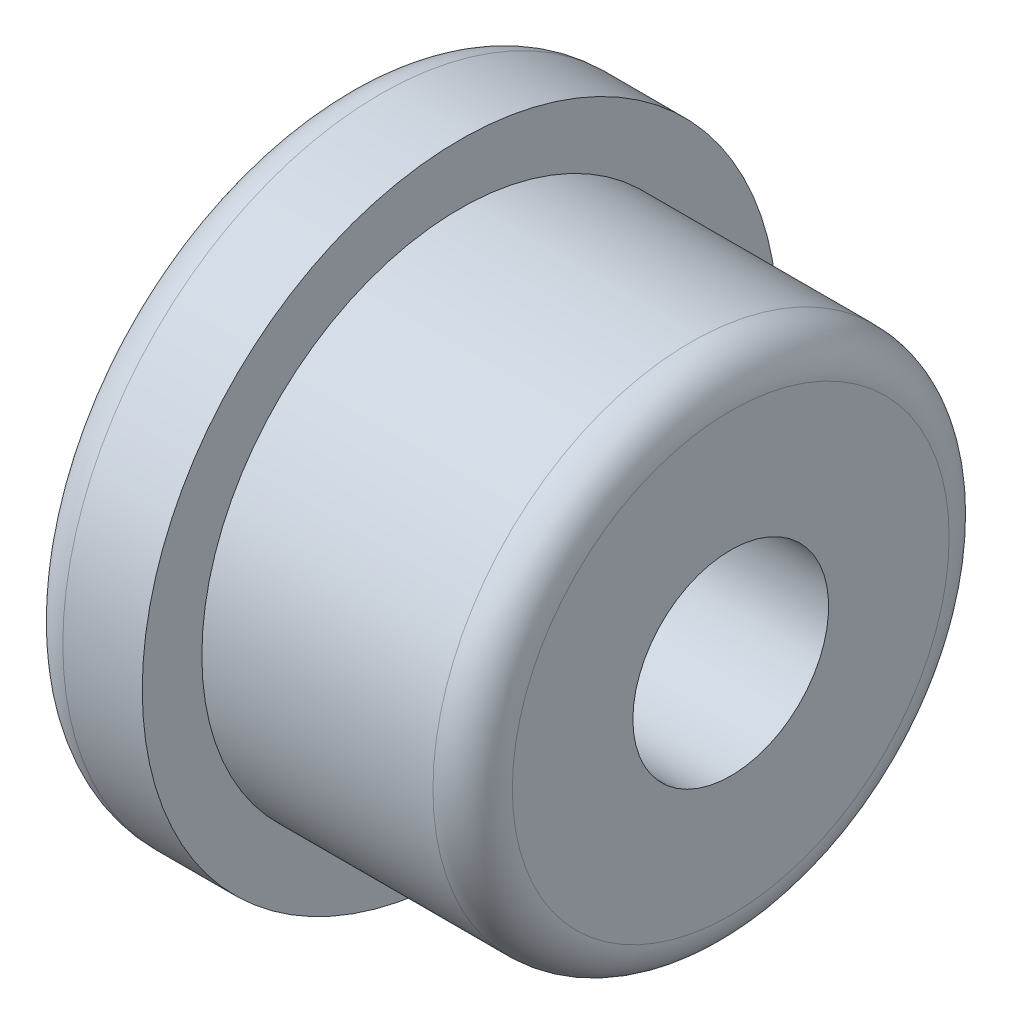
ISO-10303-21;
HEADER;
FILE_DESCRIPTION(('STEP AP214'),'2;1');
FILE_NAME('part.step','',(''),(''),'','','');
FILE_SCHEMA(('AUTOMOTIVE_DESIGN { 1 0 10303 214 1 1 1 1 }'));
ENDSEC;
DATA;
#1=APPLICATION_CONTEXT('core data for automotive mechanical design processes');
#2=APPLICATION_PROTOCOL_DEFINITION('international standard','automotive_design',2000,#1);
#3=PRODUCT_CONTEXT('',#1,'mechanical');
#4=PRODUCT('Part','Part','',(#3));
#5=PRODUCT_RELATED_PRODUCT_CATEGORY('part','',(#4));
#6=PRODUCT_DEFINITION_FORMATION('','',#4);
#7=PRODUCT_DEFINITION_CONTEXT('part definition',#1,'design');
#8=PRODUCT_DEFINITION('design','',#6,#7);
#9=PRODUCT_DEFINITION_SHAPE('','',#8);
#10=(LENGTH_UNIT() NAMED_UNIT(*) SI_UNIT(.MILLI.,.METRE.));
#11=(NAMED_UNIT(*) PLANE_ANGLE_UNIT() SI_UNIT($,.RADIAN.));
#12=(NAMED_UNIT(*) SI_UNIT($,.STERADIAN.) SOLID_ANGLE_UNIT());
#13=UNCERTAINTY_MEASURE_WITH_UNIT(LENGTH_MEASURE(1.E-05),#10,'distance_accuracy_value','');
#14=(GEOMETRIC_REPRESENTATION_CONTEXT(3) GLOBAL_UNCERTAINTY_ASSIGNED_CONTEXT((#13)) GLOBAL_UNIT_ASSIGNED_CONTEXT((#10,
#11,#12)) REPRESENTATION_CONTEXT('',''));
#15=CARTESIAN_POINT('',(0.,0.,0.));
#16=DIRECTION('',(0.,0.,1.));
#17=DIRECTION('',(1.,0.,0.));
#18=AXIS2_PLACEMENT_3D('',#15,#16,#17);
#19=CARTESIAN_POINT('',(0.,8.,0.));
#20=DIRECTION('',(1.,0.,0.));
#21=DIRECTION('',(0.,0.,-1.));
#22=AXIS2_PLACEMENT_3D('',#19,#20,#21);
#23=PLANE('',#22);
#24=CARTESIAN_POINT('',(0.,0.,0.));
#25=DIRECTION('',(1.,0.,0.));
#26=DIRECTION('',(0.,0.,-1.));
#27=AXIS2_PLACEMENT_3D('',#24,#25,#26);
#28=CIRCLE('',#27,7.);
#29=CARTESIAN_POINT('',(0.,0.,-7.));
#30=VERTEX_POINT('',#29);
#31=EDGE_CURVE('E44',#30,#30,#28,.F.);
#32=ORIENTED_EDGE('',*,*,#31,.T.);
#33=EDGE_LOOP('',(#32));
#34=FACE_BOUND('',#33,.T.);
#35=CARTESIAN_POINT('',(0.,0.,0.));
#36=DIRECTION('',(-1.,0.,0.));
#37=DIRECTION('',(0.,0.,1.));
#38=AXIS2_PLACEMENT_3D('',#35,#36,#37);
#39=CIRCLE('',#38,2.465);
#40=CARTESIAN_POINT('',(0.,0.,2.465));
#41=VERTEX_POINT('',#40);
#42=EDGE_CURVE('E57',#41,#41,#39,.T.);
#43=ORIENTED_EDGE('',*,*,#42,.F.);
#44=EDGE_LOOP('',(#43));
#45=FACE_BOUND('',#44,.T.);
#46=ADVANCED_FACE('F37',(#34,#45),#23,.F.);
#47=CARTESIAN_POINT('',(0.,0.,0.));
#48=DIRECTION('',(-1.,0.,0.));
#49=DIRECTION('',(0.,0.,1.));
#50=AXIS2_PLACEMENT_3D('',#47,#48,#49);
#51=CYLINDRICAL_SURFACE('',#50,2.465);
#52=CARTESIAN_POINT('',(9.82,0.,0.));
#53=DIRECTION('',(-1.,0.,0.));
#54=DIRECTION('',(0.,0.,1.));
#55=AXIS2_PLACEMENT_3D('',#52,#53,#54);
#56=CIRCLE('',#55,2.465);
#57=CARTESIAN_POINT('',(9.82,0.,2.465));
#58=VERTEX_POINT('',#57);
#59=EDGE_CURVE('E60',#58,#58,#56,.T.);
#60=ORIENTED_EDGE('',*,*,#59,.F.);
#61=EDGE_LOOP('',(#60));
#62=FACE_BOUND('',#61,.T.);
#63=ORIENTED_EDGE('',*,*,#42,.T.);
#64=EDGE_LOOP('',(#63));
#65=FACE_BOUND('',#64,.T.);
#66=ADVANCED_FACE('F87',(#62,#65),#51,.F.);
#67=CARTESIAN_POINT('',(9.82,2.465,0.));
#68=DIRECTION('',(-1.,0.,0.));
#69=DIRECTION('',(0.,0.,1.));
#70=AXIS2_PLACEMENT_3D('',#67,#68,#69);
#71=PLANE('',#70);
#72=CARTESIAN_POINT('',(9.82,0.,0.));
#73=DIRECTION('',(-1.,0.,0.));
#74=DIRECTION('',(0.,0.,1.));
#75=AXIS2_PLACEMENT_3D('',#72,#73,#74);
#76=CIRCLE('',#75,5.5);
#77=CARTESIAN_POINT('',(9.82,0.,5.5));
#78=VERTEX_POINT('',#77);
#79=EDGE_CURVE('E48',#78,#78,#76,.F.);
#80=ORIENTED_EDGE('',*,*,#79,.T.);
#81=EDGE_LOOP('',(#80));
#82=FACE_BOUND('',#81,.T.);
#83=ORIENTED_EDGE('',*,*,#59,.T.);
#84=EDGE_LOOP('',(#83));
#85=FACE_BOUND('',#84,.T.);
#86=ADVANCED_FACE('F80',(#82,#85),#71,.F.);
#87=CARTESIAN_POINT('',(0.,0.,0.));
#88=DIRECTION('',(-1.,0.,0.));
#89=DIRECTION('',(0.,0.,1.));
#90=AXIS2_PLACEMENT_3D('',#87,#88,#89);
#91=CYLINDRICAL_SURFACE('',#90,6.5);
#92=CARTESIAN_POINT('',(8.82,0.,0.));
#93=DIRECTION('',(-1.,0.,0.));
#94=DIRECTION('',(0.,0.,1.));
#95=AXIS2_PLACEMENT_3D('',#92,#93,#94);
#96=CIRCLE('',#95,6.5);
#97=CARTESIAN_POINT('',(8.82,0.,6.5));
#98=VERTEX_POINT('',#97);
#99=EDGE_CURVE('E52',#98,#98,#96,.T.);
#100=ORIENTED_EDGE('',*,*,#99,.T.);
#101=EDGE_LOOP('',(#100));
#102=FACE_BOUND('',#101,.T.);
#103=CARTESIAN_POINT('',(3.,0.,0.));
#104=DIRECTION('',(-1.,0.,0.));
#105=DIRECTION('',(0.,0.,1.));
#106=AXIS2_PLACEMENT_3D('',#103,#104,#105);
#107=CIRCLE('',#106,6.5);
#108=CARTESIAN_POINT('',(3.,0.,6.5));
#109=VERTEX_POINT('',#108);
#110=EDGE_CURVE('E63',#109,#109,#107,.T.);
#111=ORIENTED_EDGE('',*,*,#110,.F.);
#112=EDGE_LOOP('',(#111));
#113=FACE_BOUND('',#112,.T.);
#114=ADVANCED_FACE('F75',(#102,#113),#91,.T.);
#115=CARTESIAN_POINT('',(3.,6.5,0.));
#116=DIRECTION('',(-1.,0.,0.));
#117=DIRECTION('',(0.,0.,1.));
#118=AXIS2_PLACEMENT_3D('',#115,#116,#117);
#119=PLANE('',#118);
#120=CARTESIAN_POINT('',(3.,0.,0.));
#121=DIRECTION('',(-1.,0.,0.));
#122=DIRECTION('',(0.,0.,1.));
#123=AXIS2_PLACEMENT_3D('',#120,#121,#122);
#124=CIRCLE('',#123,8.);
#125=CARTESIAN_POINT('',(3.,0.,8.));
#126=VERTEX_POINT('',#125);
#127=EDGE_CURVE('E66',#126,#126,#124,.T.);
#128=ORIENTED_EDGE('',*,*,#127,.F.);
#129=EDGE_LOOP('',(#128));
#130=FACE_BOUND('',#129,.T.);
#131=ORIENTED_EDGE('',*,*,#110,.T.);
#132=EDGE_LOOP('',(#131));
#133=FACE_BOUND('',#132,.T.);
#134=ADVANCED_FACE('F72',(#130,#133),#119,.F.);
#135=CARTESIAN_POINT('',(0.,0.,0.));
#136=DIRECTION('',(-1.,0.,0.));
#137=DIRECTION('',(0.,0.,1.));
#138=AXIS2_PLACEMENT_3D('',#135,#136,#137);
#139=CYLINDRICAL_SURFACE('',#138,8.);
#140=CARTESIAN_POINT('',(1.,0.,0.));
#141=DIRECTION('',(1.,0.,0.));
#142=DIRECTION('',(0.,0.,-1.));
#143=AXIS2_PLACEMENT_3D('',#140,#141,#142);
#144=CIRCLE('',#143,8.);
#145=CARTESIAN_POINT('',(1.,0.,-8.));
#146=VERTEX_POINT('',#145);
#147=EDGE_CURVE('E10',#146,#146,#144,.T.);
#148=ORIENTED_EDGE('',*,*,#147,.T.);
#149=EDGE_LOOP('',(#148));
#150=FACE_BOUND('',#149,.T.);
#151=ORIENTED_EDGE('',*,*,#127,.T.);
#152=EDGE_LOOP('',(#151));
#153=FACE_BOUND('',#152,.T.);
#154=ADVANCED_FACE('F70',(#150,#153),#139,.T.);
#155=CARTESIAN_POINT('',(8.82,0.,0.));
#156=DIRECTION('',(-1.,0.,0.));
#157=DIRECTION('',(0.,0.,1.));
#158=AXIS2_PLACEMENT_3D('',#155,#156,#157);
#159=TOROIDAL_SURFACE('',#158,5.5,1.);
#160=ORIENTED_EDGE('',*,*,#79,.F.);
#161=EDGE_LOOP('',(#160));
#162=FACE_BOUND('',#161,.T.);
#163=ORIENTED_EDGE('',*,*,#99,.F.);
#164=EDGE_LOOP('',(#163));
#165=FACE_BOUND('',#164,.T.);
#166=ADVANCED_FACE('F98',(#162,#165),#159,.T.);
#167=CARTESIAN_POINT('',(1.,0.,0.));
#168=DIRECTION('',(1.,0.,0.));
#169=DIRECTION('',(0.,0.,-1.));
#170=AXIS2_PLACEMENT_3D('',#167,#168,#169);
#171=TOROIDAL_SURFACE('',#170,7.,1.);
#172=ORIENTED_EDGE('',*,*,#147,.F.);
#173=EDGE_LOOP('',(#172));
#174=FACE_BOUND('',#173,.T.);
#175=ORIENTED_EDGE('',*,*,#31,.F.);
#176=EDGE_LOOP('',(#175));
#177=FACE_BOUND('',#176,.T.);
#178=ADVANCED_FACE('F39',(#174,#177),#171,.T.);
#179=CLOSED_SHELL('',(#46,#66,#86,#114,#134,#154,#166,#178));
#180=MANIFOLD_SOLID_BREP('B2',#179);
#181=ADVANCED_BREP_SHAPE_REPRESENTATION('',(#18,#180),#14);
#182=SHAPE_DEFINITION_REPRESENTATION(#9,#181);
ENDSEC;
END-ISO-10303-21;
